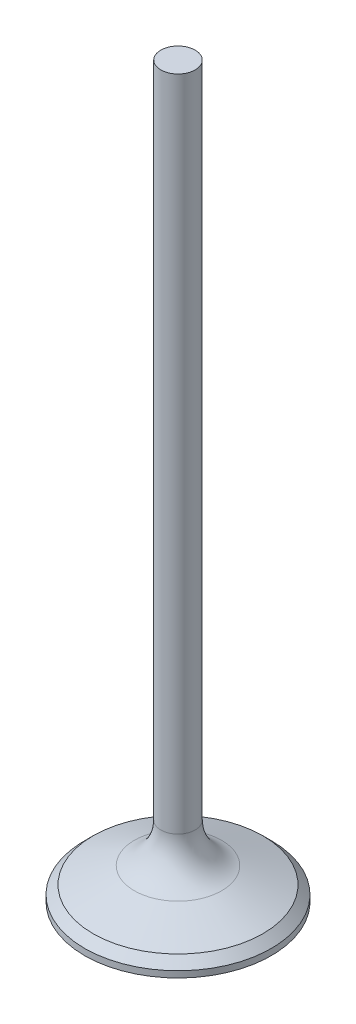
ISO-10303-21;
HEADER;
FILE_DESCRIPTION(('STEP AP214'),'2;1');
FILE_NAME('part.step','',(''),(''),'','','');
FILE_SCHEMA(('AUTOMOTIVE_DESIGN { 1 0 10303 214 1 1 1 1 }'));
ENDSEC;
DATA;
#1=APPLICATION_CONTEXT('core data for automotive mechanical design processes');
#2=APPLICATION_PROTOCOL_DEFINITION('international standard','automotive_design',2000,#1);
#3=PRODUCT_CONTEXT('',#1,'mechanical');
#4=PRODUCT('Part','Part','',(#3));
#5=PRODUCT_RELATED_PRODUCT_CATEGORY('part','',(#4));
#6=PRODUCT_DEFINITION_FORMATION('','',#4);
#7=PRODUCT_DEFINITION_CONTEXT('part definition',#1,'design');
#8=PRODUCT_DEFINITION('design','',#6,#7);
#9=PRODUCT_DEFINITION_SHAPE('','',#8);
#10=(LENGTH_UNIT() NAMED_UNIT(*) SI_UNIT(.MILLI.,.METRE.));
#11=(NAMED_UNIT(*) PLANE_ANGLE_UNIT() SI_UNIT($,.RADIAN.));
#12=(NAMED_UNIT(*) SI_UNIT($,.STERADIAN.) SOLID_ANGLE_UNIT());
#13=UNCERTAINTY_MEASURE_WITH_UNIT(LENGTH_MEASURE(1.E-05),#10,'distance_accuracy_value','');
#14=(GEOMETRIC_REPRESENTATION_CONTEXT(3) GLOBAL_UNCERTAINTY_ASSIGNED_CONTEXT((#13)) GLOBAL_UNIT_ASSIGNED_CONTEXT((#10,
#11,#12)) REPRESENTATION_CONTEXT('',''));
#15=CARTESIAN_POINT('',(0.,0.,0.));
#16=DIRECTION('',(0.,0.,1.));
#17=DIRECTION('',(1.,0.,0.));
#18=AXIS2_PLACEMENT_3D('',#15,#16,#17);
#19=CARTESIAN_POINT('',(2.73,115.95,0.));
#20=DIRECTION('',(0.,1.,0.));
#21=DIRECTION('',(0.,0.,1.));
#22=AXIS2_PLACEMENT_3D('',#19,#20,#21);
#23=PLANE('',#22);
#24=CARTESIAN_POINT('',(0.,115.95,0.));
#25=DIRECTION('',(0.,-1.,0.));
#26=DIRECTION('',(0.,0.,-1.));
#27=AXIS2_PLACEMENT_3D('',#24,#25,#26);
#28=CIRCLE('',#27,2.73);
#29=CARTESIAN_POINT('',(0.,115.95,-2.73));
#30=VERTEX_POINT('',#29);
#31=EDGE_CURVE('E10',#30,#30,#28,.T.);
#32=ORIENTED_EDGE('',*,*,#31,.F.);
#33=EDGE_LOOP('',(#32));
#34=FACE_BOUND('',#33,.T.);
#35=ADVANCED_FACE('F35',(#34),#23,.T.);
#36=CARTESIAN_POINT('',(0.,0.,0.));
#37=DIRECTION('',(0.,-1.,0.));
#38=DIRECTION('',(0.,0.,-1.));
#39=AXIS2_PLACEMENT_3D('',#36,#37,#38);
#40=CYLINDRICAL_SURFACE('',#39,2.73);
#41=ORIENTED_EDGE('',*,*,#31,.T.);
#42=EDGE_LOOP('',(#41));
#43=FACE_BOUND('',#42,.T.);
#44=CARTESIAN_POINT('',(0.,11.254294940931,0.));
#45=DIRECTION('',(0.,-1.,0.));
#46=DIRECTION('',(0.,0.,-1.));
#47=AXIS2_PLACEMENT_3D('',#44,#45,#46);
#48=CIRCLE('',#47,2.73);
#49=CARTESIAN_POINT('',(0.,11.254294940931,-2.73));
#50=VERTEX_POINT('',#49);
#51=EDGE_CURVE('E41',#50,#50,#48,.T.);
#52=ORIENTED_EDGE('',*,*,#51,.F.);
#53=EDGE_LOOP('',(#52));
#54=FACE_BOUND('',#53,.T.);
#55=ADVANCED_FACE('F77',(#43,#54),#40,.T.);
#56=CARTESIAN_POINT('',(0.,11.254294940931,0.));
#57=DIRECTION('',(0.,-1.,0.));
#58=DIRECTION('',(0.,0.,-1.));
#59=AXIS2_PLACEMENT_3D('',#56,#57,#58);
#60=TOROIDAL_SURFACE('',#59,9.48,6.75);
#61=ORIENTED_EDGE('',*,*,#51,.T.);
#62=EDGE_LOOP('',(#61));
#63=FACE_BOUND('',#62,.T.);
#64=CARTESIAN_POINT('',(0.,4.99580392260513,0.));
#65=DIRECTION('',(0.,-1.,0.));
#66=DIRECTION('',(0.,0.,-1.));
#67=AXIS2_PLACEMENT_3D('',#64,#65,#66);
#68=CIRCLE('',#67,6.95140549444263);
#69=CARTESIAN_POINT('',(0.,4.99580392260513,-6.95140549444263));
#70=VERTEX_POINT('',#69);
#71=EDGE_CURVE('E45',#70,#70,#68,.T.);
#72=ORIENTED_EDGE('',*,*,#71,.F.);
#73=EDGE_LOOP('',(#72));
#74=FACE_BOUND('',#73,.T.);
#75=ADVANCED_FACE('F82',(#63,#74),#60,.F.);
#76=CARTESIAN_POINT('',(0.,2.34999999999999,0.));
#77=DIRECTION('',(0.,-1.,0.));
#78=DIRECTION('',(0.,0.,-1.));
#79=AXIS2_PLACEMENT_3D('',#76,#77,#78);
#80=CONICAL_SURFACE('',#79,13.5,1.18682389135615);
#81=ORIENTED_EDGE('',*,*,#71,.T.);
#82=EDGE_LOOP('',(#81));
#83=FACE_BOUND('',#82,.T.);
#84=CARTESIAN_POINT('',(0.,2.34999999999999,0.));
#85=DIRECTION('',(0.,-1.,0.));
#86=DIRECTION('',(0.,0.,-1.));
#87=AXIS2_PLACEMENT_3D('',#84,#85,#86);
#88=CIRCLE('',#87,13.5);
#89=CARTESIAN_POINT('',(0.,2.34999999999999,-13.5));
#90=VERTEX_POINT('',#89);
#91=EDGE_CURVE('E49',#90,#90,#88,.T.);
#92=ORIENTED_EDGE('',*,*,#91,.F.);
#93=EDGE_LOOP('',(#92));
#94=FACE_BOUND('',#93,.T.);
#95=ADVANCED_FACE('F73',(#83,#94),#80,.T.);
#96=CARTESIAN_POINT('',(0.,1.,0.));
#97=DIRECTION('',(0.,-1.,0.));
#98=DIRECTION('',(0.,0.,-1.));
#99=AXIS2_PLACEMENT_3D('',#96,#97,#98);
#100=CONICAL_SURFACE('',#99,14.85,0.785398163397454);
#101=ORIENTED_EDGE('',*,*,#91,.T.);
#102=EDGE_LOOP('',(#101));
#103=FACE_BOUND('',#102,.T.);
#104=CARTESIAN_POINT('',(0.,1.,0.));
#105=DIRECTION('',(0.,-1.,0.));
#106=DIRECTION('',(0.,0.,-1.));
#107=AXIS2_PLACEMENT_3D('',#104,#105,#106);
#108=CIRCLE('',#107,14.85);
#109=CARTESIAN_POINT('',(0.,1.,-14.85));
#110=VERTEX_POINT('',#109);
#111=EDGE_CURVE('E54',#110,#110,#108,.T.);
#112=ORIENTED_EDGE('',*,*,#111,.F.);
#113=EDGE_LOOP('',(#112));
#114=FACE_BOUND('',#113,.T.);
#115=ADVANCED_FACE('F65',(#103,#114),#100,.T.);
#116=CARTESIAN_POINT('',(0.,0.,0.));
#117=DIRECTION('',(0.,-1.,0.));
#118=DIRECTION('',(0.,0.,-1.));
#119=AXIS2_PLACEMENT_3D('',#116,#117,#118);
#120=CYLINDRICAL_SURFACE('',#119,14.85);
#121=ORIENTED_EDGE('',*,*,#111,.T.);
#122=EDGE_LOOP('',(#121));
#123=FACE_BOUND('',#122,.T.);
#124=CARTESIAN_POINT('',(0.,0.,0.));
#125=DIRECTION('',(0.,-1.,0.));
#126=DIRECTION('',(0.,0.,-1.));
#127=AXIS2_PLACEMENT_3D('',#124,#125,#126);
#128=CIRCLE('',#127,14.85);
#129=CARTESIAN_POINT('',(0.,0.,-14.85));
#130=VERTEX_POINT('',#129);
#131=EDGE_CURVE('E57',#130,#130,#128,.T.);
#132=ORIENTED_EDGE('',*,*,#131,.F.);
#133=EDGE_LOOP('',(#132));
#134=FACE_BOUND('',#133,.T.);
#135=ADVANCED_FACE('F63',(#123,#134),#120,.T.);
#136=CARTESIAN_POINT('',(0.,0.,0.));
#137=DIRECTION('',(0.,-1.,0.));
#138=DIRECTION('',(0.,0.,-1.));
#139=AXIS2_PLACEMENT_3D('',#136,#137,#138);
#140=PLANE('',#139);
#141=ORIENTED_EDGE('',*,*,#131,.T.);
#142=EDGE_LOOP('',(#141));
#143=FACE_BOUND('',#142,.T.);
#144=ADVANCED_FACE('F61',(#143),#140,.T.);
#145=CLOSED_SHELL('',(#35,#55,#75,#95,#115,#135,#144));
#146=MANIFOLD_SOLID_BREP('B2',#145);
#147=ADVANCED_BREP_SHAPE_REPRESENTATION('',(#18,#146),#14);
#148=SHAPE_DEFINITION_REPRESENTATION(#9,#147);
ENDSEC;
END-ISO-10303-21;
